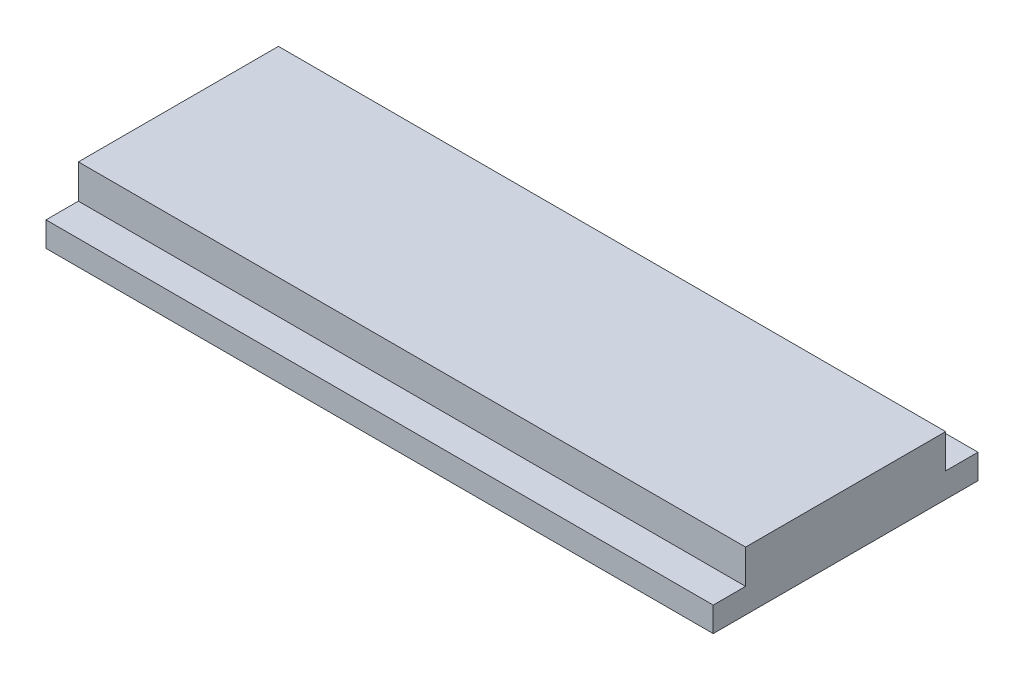
ISO-10303-21;
HEADER;
FILE_DESCRIPTION(('STEP AP214'),'2;1');
FILE_NAME('part.step','',(''),(''),'','','');
FILE_SCHEMA(('AUTOMOTIVE_DESIGN { 1 0 10303 214 1 1 1 1 }'));
ENDSEC;
DATA;
#1=APPLICATION_CONTEXT('core data for automotive mechanical design processes');
#2=APPLICATION_PROTOCOL_DEFINITION('international standard','automotive_design',2000,#1);
#3=PRODUCT_CONTEXT('',#1,'mechanical');
#4=PRODUCT('Part','Part','',(#3));
#5=PRODUCT_RELATED_PRODUCT_CATEGORY('part','',(#4));
#6=PRODUCT_DEFINITION_FORMATION('','',#4);
#7=PRODUCT_DEFINITION_CONTEXT('part definition',#1,'design');
#8=PRODUCT_DEFINITION('design','',#6,#7);
#9=PRODUCT_DEFINITION_SHAPE('','',#8);
#10=(LENGTH_UNIT() NAMED_UNIT(*) SI_UNIT(.MILLI.,.METRE.));
#11=(NAMED_UNIT(*) PLANE_ANGLE_UNIT() SI_UNIT($,.RADIAN.));
#12=(NAMED_UNIT(*) SI_UNIT($,.STERADIAN.) SOLID_ANGLE_UNIT());
#13=UNCERTAINTY_MEASURE_WITH_UNIT(LENGTH_MEASURE(1.E-05),#10,'distance_accuracy_value','');
#14=(GEOMETRIC_REPRESENTATION_CONTEXT(3) GLOBAL_UNCERTAINTY_ASSIGNED_CONTEXT((#13)) GLOBAL_UNIT_ASSIGNED_CONTEXT((#10,
#11,#12)) REPRESENTATION_CONTEXT('',''));
#15=CARTESIAN_POINT('',(0.,0.,0.));
#16=DIRECTION('',(0.,0.,1.));
#17=DIRECTION('',(1.,0.,0.));
#18=AXIS2_PLACEMENT_3D('',#15,#16,#17);
#19=CARTESIAN_POINT('',(-49.850106938946,8.,9.7));
#20=DIRECTION('',(0.,0.,1.));
#21=DIRECTION('',(1.,0.,0.));
#22=AXIS2_PLACEMENT_3D('',#19,#20,#21);
#23=PLANE('',#22);
#24=DIRECTION('',(0.,1.,0.));
#25=VECTOR('',#24,1.);
#26=CARTESIAN_POINT('',(-22.95,8.,9.7));
#27=LINE('',#26,#25);
#28=CARTESIAN_POINT('',(-22.95,4.7,9.7));
#29=VERTEX_POINT('',#28);
#30=CARTESIAN_POINT('',(-22.95,8.,9.7));
#31=VERTEX_POINT('',#30);
#32=EDGE_CURVE('E41',#29,#31,#27,.T.);
#33=ORIENTED_EDGE('',*,*,#32,.F.);
#34=DIRECTION('',(1.,0.,0.));
#35=VECTOR('',#34,1.);
#36=CARTESIAN_POINT('',(-49.850106938946,4.7,9.7));
#37=LINE('',#36,#35);
#38=CARTESIAN_POINT('',(41.75,4.7,9.7));
#39=VERTEX_POINT('',#38);
#40=EDGE_CURVE('E114',#29,#39,#37,.T.);
#41=ORIENTED_EDGE('',*,*,#40,.T.);
#42=DIRECTION('',(0.,-1.,0.));
#43=VECTOR('',#42,1.);
#44=CARTESIAN_POINT('',(41.75,8.,9.7));
#45=LINE('',#44,#43);
#46=CARTESIAN_POINT('',(41.75,8.,9.7));
#47=VERTEX_POINT('',#46);
#48=EDGE_CURVE('E141',#47,#39,#45,.T.);
#49=ORIENTED_EDGE('',*,*,#48,.F.);
#50=DIRECTION('',(1.,0.,0.));
#51=VECTOR('',#50,1.);
#52=CARTESIAN_POINT('',(-49.850106938946,8.,9.7));
#53=LINE('',#52,#51);
#54=EDGE_CURVE('E101',#31,#47,#53,.T.);
#55=ORIENTED_EDGE('',*,*,#54,.F.);
#56=EDGE_LOOP('',(#33,#41,#49,#55));
#57=FACE_BOUND('',#56,.T.);
#58=ADVANCED_FACE('F34',(#57),#23,.T.);
#59=CARTESIAN_POINT('',(-49.850106938946,8.,9.7));
#60=DIRECTION('',(0.,1.,0.));
#61=DIRECTION('',(0.,0.,1.));
#62=AXIS2_PLACEMENT_3D('',#59,#60,#61);
#63=PLANE('',#62);
#64=DIRECTION('',(0.,0.,-1.));
#65=VECTOR('',#64,1.);
#66=CARTESIAN_POINT('',(-22.95,8.,9.7));
#67=LINE('',#66,#65);
#68=CARTESIAN_POINT('',(-22.95,8.,-9.7));
#69=VERTEX_POINT('',#68);
#70=EDGE_CURVE('E78',#31,#69,#67,.T.);
#71=ORIENTED_EDGE('',*,*,#70,.F.);
#72=ORIENTED_EDGE('',*,*,#54,.T.);
#73=DIRECTION('',(0.,0.,1.));
#74=VECTOR('',#73,1.);
#75=CARTESIAN_POINT('',(41.75,8.,9.7));
#76=LINE('',#75,#74);
#77=CARTESIAN_POINT('',(41.75,8.,-9.7));
#78=VERTEX_POINT('',#77);
#79=EDGE_CURVE('E116',#78,#47,#76,.T.);
#80=ORIENTED_EDGE('',*,*,#79,.F.);
#81=DIRECTION('',(1.,0.,0.));
#82=VECTOR('',#81,1.);
#83=CARTESIAN_POINT('',(-49.850106938946,8.,-9.7));
#84=LINE('',#83,#82);
#85=EDGE_CURVE('E99',#69,#78,#84,.T.);
#86=ORIENTED_EDGE('',*,*,#85,.F.);
#87=EDGE_LOOP('',(#71,#72,#80,#86));
#88=FACE_BOUND('',#87,.T.);
#89=ADVANCED_FACE('F166',(#88),#63,.T.);
#90=CARTESIAN_POINT('',(-49.850106938946,4.7,-9.7));
#91=DIRECTION('',(0.,0.,-1.));
#92=DIRECTION('',(-1.,0.,0.));
#93=AXIS2_PLACEMENT_3D('',#90,#91,#92);
#94=PLANE('',#93);
#95=DIRECTION('',(0.,-1.,0.));
#96=VECTOR('',#95,1.);
#97=CARTESIAN_POINT('',(-22.95,4.7,-9.7));
#98=LINE('',#97,#96);
#99=CARTESIAN_POINT('',(-22.95,4.7,-9.7));
#100=VERTEX_POINT('',#99);
#101=EDGE_CURVE('E74',#69,#100,#98,.T.);
#102=ORIENTED_EDGE('',*,*,#101,.F.);
#103=ORIENTED_EDGE('',*,*,#85,.T.);
#104=DIRECTION('',(0.,1.,0.));
#105=VECTOR('',#104,1.);
#106=CARTESIAN_POINT('',(41.75,4.7,-9.7));
#107=LINE('',#106,#105);
#108=CARTESIAN_POINT('',(41.75,4.7,-9.7));
#109=VERTEX_POINT('',#108);
#110=EDGE_CURVE('E97',#109,#78,#107,.T.);
#111=ORIENTED_EDGE('',*,*,#110,.F.);
#112=DIRECTION('',(1.,0.,0.));
#113=VECTOR('',#112,1.);
#114=CARTESIAN_POINT('',(-49.850106938946,4.7,-9.7));
#115=LINE('',#114,#113);
#116=EDGE_CURVE('E90',#100,#109,#115,.T.);
#117=ORIENTED_EDGE('',*,*,#116,.F.);
#118=EDGE_LOOP('',(#102,#103,#111,#117));
#119=FACE_BOUND('',#118,.T.);
#120=ADVANCED_FACE('F95',(#119),#94,.T.);
#121=CARTESIAN_POINT('',(-49.850106938946,4.7,-12.8375));
#122=DIRECTION('',(0.,1.,0.));
#123=DIRECTION('',(0.,0.,1.));
#124=AXIS2_PLACEMENT_3D('',#121,#122,#123);
#125=PLANE('',#124);
#126=DIRECTION('',(0.,0.,-1.));
#127=VECTOR('',#126,1.);
#128=CARTESIAN_POINT('',(-22.95,4.7,-12.8375));
#129=LINE('',#128,#127);
#130=CARTESIAN_POINT('',(-22.95,4.7,-12.8375));
#131=VERTEX_POINT('',#130);
#132=EDGE_CURVE('E77',#100,#131,#129,.T.);
#133=ORIENTED_EDGE('',*,*,#132,.F.);
#134=ORIENTED_EDGE('',*,*,#116,.T.);
#135=DIRECTION('',(0.,0.,1.));
#136=VECTOR('',#135,1.);
#137=CARTESIAN_POINT('',(41.75,4.7,-12.8375));
#138=LINE('',#137,#136);
#139=CARTESIAN_POINT('',(41.75,4.7,-12.8375));
#140=VERTEX_POINT('',#139);
#141=EDGE_CURVE('E127',#140,#109,#138,.T.);
#142=ORIENTED_EDGE('',*,*,#141,.F.);
#143=DIRECTION('',(1.,0.,0.));
#144=VECTOR('',#143,1.);
#145=CARTESIAN_POINT('',(-49.850106938946,4.7,-12.8375));
#146=LINE('',#145,#144);
#147=EDGE_CURVE('E93',#131,#140,#146,.T.);
#148=ORIENTED_EDGE('',*,*,#147,.F.);
#149=EDGE_LOOP('',(#133,#134,#142,#148));
#150=FACE_BOUND('',#149,.T.);
#151=ADVANCED_FACE('F87',(#150),#125,.T.);
#152=CARTESIAN_POINT('',(-49.850106938946,2.3,-12.8375));
#153=DIRECTION('',(0.,0.,-1.));
#154=DIRECTION('',(0.,1.,0.));
#155=AXIS2_PLACEMENT_3D('',#152,#153,#154);
#156=PLANE('',#155);
#157=DIRECTION('',(0.,-1.,0.));
#158=VECTOR('',#157,1.);
#159=CARTESIAN_POINT('',(-22.95,2.3,-12.8375));
#160=LINE('',#159,#158);
#161=CARTESIAN_POINT('',(-22.95,2.3,-12.8375));
#162=VERTEX_POINT('',#161);
#163=EDGE_CURVE('E54',#131,#162,#160,.T.);
#164=ORIENTED_EDGE('',*,*,#163,.F.);
#165=ORIENTED_EDGE('',*,*,#147,.T.);
#166=DIRECTION('',(0.,1.,0.));
#167=VECTOR('',#166,1.);
#168=CARTESIAN_POINT('',(41.75,2.3,-12.8375));
#169=LINE('',#168,#167);
#170=CARTESIAN_POINT('',(41.75,2.3,-12.8375));
#171=VERTEX_POINT('',#170);
#172=EDGE_CURVE('E152',#171,#140,#169,.T.);
#173=ORIENTED_EDGE('',*,*,#172,.F.);
#174=DIRECTION('',(1.,0.,0.));
#175=VECTOR('',#174,1.);
#176=CARTESIAN_POINT('',(-49.850106938946,2.3,-12.8375));
#177=LINE('',#176,#175);
#178=EDGE_CURVE('E103',#162,#171,#177,.T.);
#179=ORIENTED_EDGE('',*,*,#178,.F.);
#180=EDGE_LOOP('',(#164,#165,#173,#179));
#181=FACE_BOUND('',#180,.T.);
#182=ADVANCED_FACE('F178',(#181),#156,.T.);
#183=CARTESIAN_POINT('',(-49.850106938946,2.3,12.8375));
#184=DIRECTION('',(0.,-1.,0.));
#185=DIRECTION('',(0.,0.,-1.));
#186=AXIS2_PLACEMENT_3D('',#183,#184,#185);
#187=PLANE('',#186);
#188=DIRECTION('',(0.,0.,1.));
#189=VECTOR('',#188,1.);
#190=CARTESIAN_POINT('',(-22.95,2.3,12.8375));
#191=LINE('',#190,#189);
#192=CARTESIAN_POINT('',(-22.95,2.3,12.8375));
#193=VERTEX_POINT('',#192);
#194=EDGE_CURVE('E48',#162,#193,#191,.T.);
#195=ORIENTED_EDGE('',*,*,#194,.F.);
#196=ORIENTED_EDGE('',*,*,#178,.T.);
#197=DIRECTION('',(0.,0.,-1.));
#198=VECTOR('',#197,1.);
#199=CARTESIAN_POINT('',(41.75,2.3,12.8375));
#200=LINE('',#199,#198);
#201=CARTESIAN_POINT('',(41.75,2.3,12.8375));
#202=VERTEX_POINT('',#201);
#203=EDGE_CURVE('E149',#202,#171,#200,.T.);
#204=ORIENTED_EDGE('',*,*,#203,.F.);
#205=DIRECTION('',(1.,0.,0.));
#206=VECTOR('',#205,1.);
#207=CARTESIAN_POINT('',(-49.850106938946,2.3,12.8375));
#208=LINE('',#207,#206);
#209=EDGE_CURVE('E109',#193,#202,#208,.T.);
#210=ORIENTED_EDGE('',*,*,#209,.F.);
#211=EDGE_LOOP('',(#195,#196,#204,#210));
#212=FACE_BOUND('',#211,.T.);
#213=ADVANCED_FACE('F176',(#212),#187,.T.);
#214=CARTESIAN_POINT('',(-49.850106938946,4.7,12.8375));
#215=DIRECTION('',(0.,0.,1.));
#216=DIRECTION('',(0.,-1.,0.));
#217=AXIS2_PLACEMENT_3D('',#214,#215,#216);
#218=PLANE('',#217);
#219=DIRECTION('',(0.,1.,0.));
#220=VECTOR('',#219,1.);
#221=CARTESIAN_POINT('',(-22.95,4.7,12.8375));
#222=LINE('',#221,#220);
#223=CARTESIAN_POINT('',(-22.95,4.7,12.8375));
#224=VERTEX_POINT('',#223);
#225=EDGE_CURVE('E131',#193,#224,#222,.T.);
#226=ORIENTED_EDGE('',*,*,#225,.F.);
#227=ORIENTED_EDGE('',*,*,#209,.T.);
#228=DIRECTION('',(0.,-1.,0.));
#229=VECTOR('',#228,1.);
#230=CARTESIAN_POINT('',(41.75,4.7,12.8375));
#231=LINE('',#230,#229);
#232=CARTESIAN_POINT('',(41.75,4.7,12.8375));
#233=VERTEX_POINT('',#232);
#234=EDGE_CURVE('E146',#233,#202,#231,.T.);
#235=ORIENTED_EDGE('',*,*,#234,.F.);
#236=DIRECTION('',(1.,0.,0.));
#237=VECTOR('',#236,1.);
#238=CARTESIAN_POINT('',(-49.850106938946,4.7,12.8375));
#239=LINE('',#238,#237);
#240=EDGE_CURVE('E112',#224,#233,#239,.T.);
#241=ORIENTED_EDGE('',*,*,#240,.F.);
#242=EDGE_LOOP('',(#226,#227,#235,#241));
#243=FACE_BOUND('',#242,.T.);
#244=ADVANCED_FACE('F174',(#243),#218,.T.);
#245=CARTESIAN_POINT('',(-49.850106938946,4.7,9.7));
#246=DIRECTION('',(0.,1.,0.));
#247=DIRECTION('',(0.,0.,1.));
#248=AXIS2_PLACEMENT_3D('',#245,#246,#247);
#249=PLANE('',#248);
#250=DIRECTION('',(0.,0.,-1.));
#251=VECTOR('',#250,1.);
#252=CARTESIAN_POINT('',(-22.95,4.7,9.7));
#253=LINE('',#252,#251);
#254=EDGE_CURVE('E11',#224,#29,#253,.T.);
#255=ORIENTED_EDGE('',*,*,#254,.F.);
#256=ORIENTED_EDGE('',*,*,#240,.T.);
#257=DIRECTION('',(0.,0.,1.));
#258=VECTOR('',#257,1.);
#259=CARTESIAN_POINT('',(41.75,4.7,9.7));
#260=LINE('',#259,#258);
#261=EDGE_CURVE('E143',#39,#233,#260,.T.);
#262=ORIENTED_EDGE('',*,*,#261,.F.);
#263=ORIENTED_EDGE('',*,*,#40,.F.);
#264=EDGE_LOOP('',(#255,#256,#262,#263));
#265=FACE_BOUND('',#264,.T.);
#266=ADVANCED_FACE('F199',(#265),#249,.T.);
#267=CARTESIAN_POINT('',(41.75,0.,0.));
#268=DIRECTION('',(-1.,0.,0.));
#269=DIRECTION('',(0.,0.,1.));
#270=AXIS2_PLACEMENT_3D('',#267,#268,#269);
#271=PLANE('',#270);
#272=ORIENTED_EDGE('',*,*,#48,.T.);
#273=ORIENTED_EDGE('',*,*,#261,.T.);
#274=ORIENTED_EDGE('',*,*,#234,.T.);
#275=ORIENTED_EDGE('',*,*,#203,.T.);
#276=ORIENTED_EDGE('',*,*,#172,.T.);
#277=ORIENTED_EDGE('',*,*,#141,.T.);
#278=ORIENTED_EDGE('',*,*,#110,.T.);
#279=ORIENTED_EDGE('',*,*,#79,.T.);
#280=EDGE_LOOP('',(#272,#273,#274,#275,#276,#277,#278,#279));
#281=FACE_BOUND('',#280,.T.);
#282=ADVANCED_FACE('F154',(#281),#271,.F.);
#283=CARTESIAN_POINT('',(-22.95,0.,0.));
#284=DIRECTION('',(1.,0.,0.));
#285=DIRECTION('',(0.,0.,-1.));
#286=AXIS2_PLACEMENT_3D('',#283,#284,#285);
#287=PLANE('',#286);
#288=ORIENTED_EDGE('',*,*,#32,.T.);
#289=ORIENTED_EDGE('',*,*,#70,.T.);
#290=ORIENTED_EDGE('',*,*,#101,.T.);
#291=ORIENTED_EDGE('',*,*,#132,.T.);
#292=ORIENTED_EDGE('',*,*,#163,.T.);
#293=ORIENTED_EDGE('',*,*,#194,.T.);
#294=ORIENTED_EDGE('',*,*,#225,.T.);
#295=ORIENTED_EDGE('',*,*,#254,.T.);
#296=EDGE_LOOP('',(#288,#289,#290,#291,#292,#293,#294,#295));
#297=FACE_BOUND('',#296,.T.);
#298=ADVANCED_FACE('F76',(#297),#287,.F.);
#299=CLOSED_SHELL('',(#58,#89,#120,#151,#182,#213,#244,#266,#282,#298));
#300=MANIFOLD_SOLID_BREP('B2',#299);
#301=ADVANCED_BREP_SHAPE_REPRESENTATION('',(#18,#300),#14);
#302=SHAPE_DEFINITION_REPRESENTATION(#9,#301);
ENDSEC;
END-ISO-10303-21;
